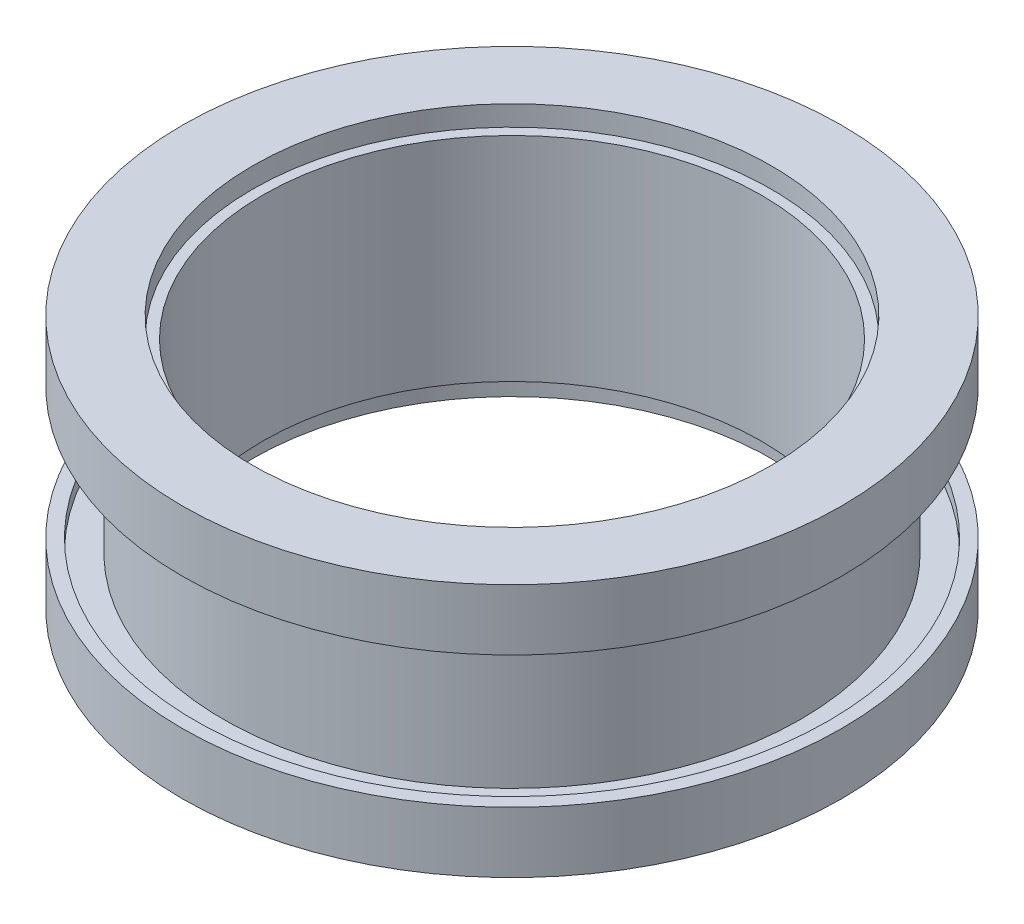
ISO-10303-21;
HEADER;
FILE_DESCRIPTION(('STEP AP214'),'2;1');
FILE_NAME('part.step','',(''),(''),'','','');
FILE_SCHEMA(('AUTOMOTIVE_DESIGN { 1 0 10303 214 1 1 1 1 }'));
ENDSEC;
DATA;
#1=APPLICATION_CONTEXT('core data for automotive mechanical design processes');
#2=APPLICATION_PROTOCOL_DEFINITION('international standard','automotive_design',2000,#1);
#3=PRODUCT_CONTEXT('',#1,'mechanical');
#4=PRODUCT('Part','Part','',(#3));
#5=PRODUCT_RELATED_PRODUCT_CATEGORY('part','',(#4));
#6=PRODUCT_DEFINITION_FORMATION('','',#4);
#7=PRODUCT_DEFINITION_CONTEXT('part definition',#1,'design');
#8=PRODUCT_DEFINITION('design','',#6,#7);
#9=PRODUCT_DEFINITION_SHAPE('','',#8);
#10=(LENGTH_UNIT() NAMED_UNIT(*) SI_UNIT(.MILLI.,.METRE.));
#11=(NAMED_UNIT(*) PLANE_ANGLE_UNIT() SI_UNIT($,.RADIAN.));
#12=(NAMED_UNIT(*) SI_UNIT($,.STERADIAN.) SOLID_ANGLE_UNIT());
#13=UNCERTAINTY_MEASURE_WITH_UNIT(LENGTH_MEASURE(1.E-05),#10,'distance_accuracy_value','');
#14=(GEOMETRIC_REPRESENTATION_CONTEXT(3) GLOBAL_UNCERTAINTY_ASSIGNED_CONTEXT((#13)) GLOBAL_UNIT_ASSIGNED_CONTEXT((#10,
#11,#12)) REPRESENTATION_CONTEXT('',''));
#15=CARTESIAN_POINT('',(0.,0.,0.));
#16=DIRECTION('',(0.,0.,1.));
#17=DIRECTION('',(1.,0.,0.));
#18=AXIS2_PLACEMENT_3D('',#15,#16,#17);
#19=CARTESIAN_POINT('',(51.15,21.,0.));
#20=DIRECTION('',(0.,1.,0.));
#21=DIRECTION('',(1.,0.,0.));
#22=AXIS2_PLACEMENT_3D('',#19,#20,#21);
#23=PLANE('',#22);
#24=CARTESIAN_POINT('',(0.,21.,0.));
#25=DIRECTION('',(0.,-1.,0.));
#26=DIRECTION('',(1.,0.,0.));
#27=AXIS2_PLACEMENT_3D('',#24,#25,#26);
#28=CIRCLE('',#27,49.15);
#29=CARTESIAN_POINT('',(-49.15,21.,0.));
#30=VERTEX_POINT('',#29);
#31=EDGE_CURVE('E11',#30,#30,#28,.T.);
#32=ORIENTED_EDGE('',*,*,#31,.T.);
#33=EDGE_LOOP('',(#32));
#34=FACE_BOUND('',#33,.T.);
#35=CARTESIAN_POINT('',(0.,21.,0.));
#36=DIRECTION('',(0.,-1.,0.));
#37=DIRECTION('',(1.,0.,0.));
#38=AXIS2_PLACEMENT_3D('',#35,#36,#37);
#39=CIRCLE('',#38,51.15);
#40=CARTESIAN_POINT('',(-51.15,21.,0.));
#41=VERTEX_POINT('',#40);
#42=EDGE_CURVE('E119',#41,#41,#39,.T.);
#43=ORIENTED_EDGE('',*,*,#42,.F.);
#44=EDGE_LOOP('',(#43));
#45=FACE_BOUND('',#44,.T.);
#46=ADVANCED_FACE('F17',(#34,#45),#23,.T.);
#47=CARTESIAN_POINT('',(0.,0.,0.));
#48=DIRECTION('',(0.,-1.,0.));
#49=DIRECTION('',(1.,0.,0.));
#50=AXIS2_PLACEMENT_3D('',#47,#48,#49);
#51=CYLINDRICAL_SURFACE('',#50,49.15);
#52=CARTESIAN_POINT('',(0.,-21.,0.));
#53=DIRECTION('',(0.,-1.,0.));
#54=DIRECTION('',(1.,0.,0.));
#55=AXIS2_PLACEMENT_3D('',#52,#53,#54);
#56=CIRCLE('',#55,49.15);
#57=CARTESIAN_POINT('',(-49.15,-21.,0.));
#58=VERTEX_POINT('',#57);
#59=EDGE_CURVE('E113',#58,#58,#56,.T.);
#60=ORIENTED_EDGE('',*,*,#59,.T.);
#61=DIRECTION('',(0.,1.,0.));
#62=VECTOR('',#61,1.);
#63=CARTESIAN_POINT('',(-49.15,0.,0.));
#64=LINE('',#63,#62);
#65=EDGE_CURVE('E21',#58,#30,#64,.T.);
#66=ORIENTED_EDGE('',*,*,#65,.T.);
#67=ORIENTED_EDGE('',*,*,#31,.F.);
#68=ORIENTED_EDGE('',*,*,#65,.F.);
#69=EDGE_LOOP('',(#60,#66,#67,#68));
#70=FACE_BOUND('',#69,.T.);
#71=ADVANCED_FACE('F19',(#70),#51,.F.);
#72=CARTESIAN_POINT('',(49.15,-21.,0.));
#73=DIRECTION('',(0.,-1.,0.));
#74=DIRECTION('',(0.,0.,-1.));
#75=AXIS2_PLACEMENT_3D('',#72,#73,#74);
#76=PLANE('',#75);
#77=ORIENTED_EDGE('',*,*,#59,.F.);
#78=EDGE_LOOP('',(#77));
#79=FACE_BOUND('',#78,.T.);
#80=CARTESIAN_POINT('',(0.,-21.,0.));
#81=DIRECTION('',(0.,-1.,0.));
#82=DIRECTION('',(1.,0.,0.));
#83=AXIS2_PLACEMENT_3D('',#80,#81,#82);
#84=CIRCLE('',#83,51.15);
#85=CARTESIAN_POINT('',(-51.15,-21.,0.));
#86=VERTEX_POINT('',#85);
#87=EDGE_CURVE('E140',#86,#86,#84,.T.);
#88=ORIENTED_EDGE('',*,*,#87,.T.);
#89=EDGE_LOOP('',(#88));
#90=FACE_BOUND('',#89,.T.);
#91=ADVANCED_FACE('F213',(#79,#90),#76,.T.);
#92=CARTESIAN_POINT('',(0.,-23.,0.));
#93=DIRECTION('',(0.,-1.,0.));
#94=DIRECTION('',(1.,0.,0.));
#95=AXIS2_PLACEMENT_3D('',#92,#93,#94);
#96=CYLINDRICAL_SURFACE('',#95,51.15);
#97=CARTESIAN_POINT('',(0.,-25.,0.));
#98=DIRECTION('',(0.,-1.,0.));
#99=DIRECTION('',(1.,0.,0.));
#100=AXIS2_PLACEMENT_3D('',#97,#98,#99);
#101=CIRCLE('',#100,51.15);
#102=CARTESIAN_POINT('',(-51.15,-25.,0.));
#103=VERTEX_POINT('',#102);
#104=EDGE_CURVE('E123',#103,#103,#101,.T.);
#105=ORIENTED_EDGE('',*,*,#104,.T.);
#106=DIRECTION('',(0.,1.,0.));
#107=VECTOR('',#106,1.);
#108=CARTESIAN_POINT('',(-51.15,-23.,0.));
#109=LINE('',#108,#107);
#110=EDGE_CURVE('E137',#103,#86,#109,.T.);
#111=ORIENTED_EDGE('',*,*,#110,.T.);
#112=ORIENTED_EDGE('',*,*,#87,.F.);
#113=ORIENTED_EDGE('',*,*,#110,.F.);
#114=EDGE_LOOP('',(#105,#111,#112,#113));
#115=FACE_BOUND('',#114,.T.);
#116=ADVANCED_FACE('F181',(#115),#96,.F.);
#117=CARTESIAN_POINT('',(51.15,-25.,0.));
#118=DIRECTION('',(0.,-1.,0.));
#119=DIRECTION('',(0.,0.,-1.));
#120=AXIS2_PLACEMENT_3D('',#117,#118,#119);
#121=PLANE('',#120);
#122=ORIENTED_EDGE('',*,*,#104,.F.);
#123=EDGE_LOOP('',(#122));
#124=FACE_BOUND('',#123,.T.);
#125=CARTESIAN_POINT('',(0.,-25.,0.));
#126=DIRECTION('',(0.,-1.,0.));
#127=DIRECTION('',(1.,0.,0.));
#128=AXIS2_PLACEMENT_3D('',#125,#126,#127);
#129=CIRCLE('',#128,65.);
#130=CARTESIAN_POINT('',(-65.,-25.,0.));
#131=VERTEX_POINT('',#130);
#132=EDGE_CURVE('E124',#131,#131,#129,.T.);
#133=ORIENTED_EDGE('',*,*,#132,.T.);
#134=EDGE_LOOP('',(#133));
#135=FACE_BOUND('',#134,.T.);
#136=ADVANCED_FACE('F184',(#124,#135),#121,.T.);
#137=CARTESIAN_POINT('',(0.,-19.,0.));
#138=DIRECTION('',(0.,-1.,0.));
#139=DIRECTION('',(1.,0.,0.));
#140=AXIS2_PLACEMENT_3D('',#137,#138,#139);
#141=CYLINDRICAL_SURFACE('',#140,65.);
#142=ORIENTED_EDGE('',*,*,#132,.F.);
#143=DIRECTION('',(0.,1.,0.));
#144=VECTOR('',#143,1.);
#145=CARTESIAN_POINT('',(-65.,-19.,0.));
#146=LINE('',#145,#144);
#147=CARTESIAN_POINT('',(-65.,-13.,0.));
#148=VERTEX_POINT('',#147);
#149=EDGE_CURVE('E120',#131,#148,#146,.T.);
#150=ORIENTED_EDGE('',*,*,#149,.T.);
#151=CARTESIAN_POINT('',(0.,-13.,0.));
#152=DIRECTION('',(0.,-1.,0.));
#153=DIRECTION('',(1.,0.,0.));
#154=AXIS2_PLACEMENT_3D('',#151,#152,#153);
#155=CIRCLE('',#154,65.);
#156=EDGE_CURVE('E148',#148,#148,#155,.T.);
#157=ORIENTED_EDGE('',*,*,#156,.T.);
#158=ORIENTED_EDGE('',*,*,#149,.F.);
#159=EDGE_LOOP('',(#142,#150,#157,#158));
#160=FACE_BOUND('',#159,.T.);
#161=ADVANCED_FACE('F187',(#160),#141,.T.);
#162=CARTESIAN_POINT('',(65.,-13.,0.));
#163=DIRECTION('',(0.,1.,0.));
#164=DIRECTION('',(1.,0.,0.));
#165=AXIS2_PLACEMENT_3D('',#162,#163,#164);
#166=PLANE('',#165);
#167=CARTESIAN_POINT('',(0.,-13.,0.));
#168=DIRECTION('',(0.,-1.,0.));
#169=DIRECTION('',(1.,0.,0.));
#170=AXIS2_PLACEMENT_3D('',#167,#168,#169);
#171=CIRCLE('',#170,62.4);
#172=CARTESIAN_POINT('',(-62.4,-13.,0.));
#173=VERTEX_POINT('',#172);
#174=EDGE_CURVE('E152',#173,#173,#171,.T.);
#175=ORIENTED_EDGE('',*,*,#174,.T.);
#176=EDGE_LOOP('',(#175));
#177=FACE_BOUND('',#176,.T.);
#178=ORIENTED_EDGE('',*,*,#156,.F.);
#179=EDGE_LOOP('',(#178));
#180=FACE_BOUND('',#179,.T.);
#181=ADVANCED_FACE('F193',(#177,#180),#166,.T.);
#182=CARTESIAN_POINT('',(0.,-14.25,0.));
#183=DIRECTION('',(0.,-1.,0.));
#184=DIRECTION('',(1.,0.,0.));
#185=AXIS2_PLACEMENT_3D('',#182,#183,#184);
#186=CYLINDRICAL_SURFACE('',#185,62.4);
#187=CARTESIAN_POINT('',(0.,-15.5,0.));
#188=DIRECTION('',(0.,-1.,0.));
#189=DIRECTION('',(1.,0.,0.));
#190=AXIS2_PLACEMENT_3D('',#187,#188,#189);
#191=CIRCLE('',#190,62.4);
#192=CARTESIAN_POINT('',(-62.4,-15.5,0.));
#193=VERTEX_POINT('',#192);
#194=EDGE_CURVE('E100',#193,#193,#191,.T.);
#195=ORIENTED_EDGE('',*,*,#194,.T.);
#196=DIRECTION('',(0.,1.,0.));
#197=VECTOR('',#196,1.);
#198=CARTESIAN_POINT('',(-62.4,-14.25,0.));
#199=LINE('',#198,#197);
#200=EDGE_CURVE('E108',#193,#173,#199,.T.);
#201=ORIENTED_EDGE('',*,*,#200,.T.);
#202=ORIENTED_EDGE('',*,*,#174,.F.);
#203=ORIENTED_EDGE('',*,*,#200,.F.);
#204=EDGE_LOOP('',(#195,#201,#202,#203));
#205=FACE_BOUND('',#204,.T.);
#206=ADVANCED_FACE('F195',(#205),#186,.F.);
#207=CARTESIAN_POINT('',(62.4,-15.5,0.));
#208=DIRECTION('',(0.,1.,0.));
#209=DIRECTION('',(1.,0.,0.));
#210=AXIS2_PLACEMENT_3D('',#207,#208,#209);
#211=PLANE('',#210);
#212=CARTESIAN_POINT('',(0.,-15.5,0.));
#213=DIRECTION('',(0.,-1.,0.));
#214=DIRECTION('',(1.,0.,0.));
#215=AXIS2_PLACEMENT_3D('',#212,#213,#214);
#216=CIRCLE('',#215,56.9);
#217=CARTESIAN_POINT('',(-56.9,-15.5,0.));
#218=VERTEX_POINT('',#217);
#219=EDGE_CURVE('E98',#218,#218,#216,.T.);
#220=ORIENTED_EDGE('',*,*,#219,.T.);
#221=EDGE_LOOP('',(#220));
#222=FACE_BOUND('',#221,.T.);
#223=ORIENTED_EDGE('',*,*,#194,.F.);
#224=EDGE_LOOP('',(#223));
#225=FACE_BOUND('',#224,.T.);
#226=ADVANCED_FACE('F203',(#222,#225),#211,.T.);
#227=CARTESIAN_POINT('',(0.,0.,0.));
#228=DIRECTION('',(0.,-1.,0.));
#229=DIRECTION('',(1.,0.,0.));
#230=AXIS2_PLACEMENT_3D('',#227,#228,#229);
#231=CYLINDRICAL_SURFACE('',#230,56.9);
#232=ORIENTED_EDGE('',*,*,#219,.F.);
#233=DIRECTION('',(0.,1.,0.));
#234=VECTOR('',#233,1.);
#235=CARTESIAN_POINT('',(-56.9,0.,0.));
#236=LINE('',#235,#234);
#237=CARTESIAN_POINT('',(-56.9,15.5,0.));
#238=VERTEX_POINT('',#237);
#239=EDGE_CURVE('E93',#218,#238,#236,.T.);
#240=ORIENTED_EDGE('',*,*,#239,.T.);
#241=CARTESIAN_POINT('',(0.,15.5,0.));
#242=DIRECTION('',(0.,-1.,0.));
#243=DIRECTION('',(1.,0.,0.));
#244=AXIS2_PLACEMENT_3D('',#241,#242,#243);
#245=CIRCLE('',#244,56.9);
#246=EDGE_CURVE('E96',#238,#238,#245,.T.);
#247=ORIENTED_EDGE('',*,*,#246,.T.);
#248=ORIENTED_EDGE('',*,*,#239,.F.);
#249=EDGE_LOOP('',(#232,#240,#247,#248));
#250=FACE_BOUND('',#249,.T.);
#251=ADVANCED_FACE('F94',(#250),#231,.T.);
#252=CARTESIAN_POINT('',(56.9,15.5,0.));
#253=DIRECTION('',(0.,-1.,0.));
#254=DIRECTION('',(0.,0.,-1.));
#255=AXIS2_PLACEMENT_3D('',#252,#253,#254);
#256=PLANE('',#255);
#257=ORIENTED_EDGE('',*,*,#246,.F.);
#258=EDGE_LOOP('',(#257));
#259=FACE_BOUND('',#258,.T.);
#260=CARTESIAN_POINT('',(0.,15.5,0.));
#261=DIRECTION('',(0.,-1.,0.));
#262=DIRECTION('',(1.,0.,0.));
#263=AXIS2_PLACEMENT_3D('',#260,#261,#262);
#264=CIRCLE('',#263,62.4);
#265=CARTESIAN_POINT('',(-62.4,15.5,0.));
#266=VERTEX_POINT('',#265);
#267=EDGE_CURVE('E133',#266,#266,#264,.T.);
#268=ORIENTED_EDGE('',*,*,#267,.T.);
#269=EDGE_LOOP('',(#268));
#270=FACE_BOUND('',#269,.T.);
#271=ADVANCED_FACE('F231',(#259,#270),#256,.T.);
#272=CARTESIAN_POINT('',(0.,14.25,0.));
#273=DIRECTION('',(0.,-1.,0.));
#274=DIRECTION('',(1.,0.,0.));
#275=AXIS2_PLACEMENT_3D('',#272,#273,#274);
#276=CYLINDRICAL_SURFACE('',#275,62.4);
#277=CARTESIAN_POINT('',(0.,13.,0.));
#278=DIRECTION('',(0.,-1.,0.));
#279=DIRECTION('',(1.,0.,0.));
#280=AXIS2_PLACEMENT_3D('',#277,#278,#279);
#281=CIRCLE('',#280,62.4);
#282=CARTESIAN_POINT('',(-62.4,13.,0.));
#283=VERTEX_POINT('',#282);
#284=EDGE_CURVE('E156',#283,#283,#281,.T.);
#285=ORIENTED_EDGE('',*,*,#284,.T.);
#286=DIRECTION('',(0.,1.,0.));
#287=VECTOR('',#286,1.);
#288=CARTESIAN_POINT('',(-62.4,14.25,0.));
#289=LINE('',#288,#287);
#290=EDGE_CURVE('E136',#283,#266,#289,.T.);
#291=ORIENTED_EDGE('',*,*,#290,.T.);
#292=ORIENTED_EDGE('',*,*,#267,.F.);
#293=ORIENTED_EDGE('',*,*,#290,.F.);
#294=EDGE_LOOP('',(#285,#291,#292,#293));
#295=FACE_BOUND('',#294,.T.);
#296=ADVANCED_FACE('F226',(#295),#276,.F.);
#297=CARTESIAN_POINT('',(62.4,13.,0.));
#298=DIRECTION('',(0.,-1.,0.));
#299=DIRECTION('',(0.,0.,-1.));
#300=AXIS2_PLACEMENT_3D('',#297,#298,#299);
#301=PLANE('',#300);
#302=ORIENTED_EDGE('',*,*,#284,.F.);
#303=EDGE_LOOP('',(#302));
#304=FACE_BOUND('',#303,.T.);
#305=CARTESIAN_POINT('',(0.,13.,0.));
#306=DIRECTION('',(0.,-1.,0.));
#307=DIRECTION('',(1.,0.,0.));
#308=AXIS2_PLACEMENT_3D('',#305,#306,#307);
#309=CIRCLE('',#308,65.);
#310=CARTESIAN_POINT('',(-65.,13.,0.));
#311=VERTEX_POINT('',#310);
#312=EDGE_CURVE('E125',#311,#311,#309,.T.);
#313=ORIENTED_EDGE('',*,*,#312,.T.);
#314=EDGE_LOOP('',(#313));
#315=FACE_BOUND('',#314,.T.);
#316=ADVANCED_FACE('F223',(#304,#315),#301,.T.);
#317=CARTESIAN_POINT('',(0.,19.,0.));
#318=DIRECTION('',(0.,-1.,0.));
#319=DIRECTION('',(1.,0.,0.));
#320=AXIS2_PLACEMENT_3D('',#317,#318,#319);
#321=CYLINDRICAL_SURFACE('',#320,65.);
#322=ORIENTED_EDGE('',*,*,#312,.F.);
#323=DIRECTION('',(0.,1.,0.));
#324=VECTOR('',#323,1.);
#325=CARTESIAN_POINT('',(-65.,19.,0.));
#326=LINE('',#325,#324);
#327=CARTESIAN_POINT('',(-65.,25.,0.));
#328=VERTEX_POINT('',#327);
#329=EDGE_CURVE('E129',#311,#328,#326,.T.);
#330=ORIENTED_EDGE('',*,*,#329,.T.);
#331=CARTESIAN_POINT('',(0.,25.,0.));
#332=DIRECTION('',(0.,-1.,0.));
#333=DIRECTION('',(1.,0.,0.));
#334=AXIS2_PLACEMENT_3D('',#331,#332,#333);
#335=CIRCLE('',#334,65.);
#336=EDGE_CURVE('E130',#328,#328,#335,.T.);
#337=ORIENTED_EDGE('',*,*,#336,.T.);
#338=ORIENTED_EDGE('',*,*,#329,.F.);
#339=EDGE_LOOP('',(#322,#330,#337,#338));
#340=FACE_BOUND('',#339,.T.);
#341=ADVANCED_FACE('F221',(#340),#321,.T.);
#342=CARTESIAN_POINT('',(65.,25.,0.));
#343=DIRECTION('',(0.,1.,0.));
#344=DIRECTION('',(1.,0.,0.));
#345=AXIS2_PLACEMENT_3D('',#342,#343,#344);
#346=PLANE('',#345);
#347=CARTESIAN_POINT('',(0.,25.,0.));
#348=DIRECTION('',(0.,-1.,0.));
#349=DIRECTION('',(1.,0.,0.));
#350=AXIS2_PLACEMENT_3D('',#347,#348,#349);
#351=CIRCLE('',#350,51.15);
#352=CARTESIAN_POINT('',(-51.15,25.,0.));
#353=VERTEX_POINT('',#352);
#354=EDGE_CURVE('E118',#353,#353,#351,.T.);
#355=ORIENTED_EDGE('',*,*,#354,.T.);
#356=EDGE_LOOP('',(#355));
#357=FACE_BOUND('',#356,.T.);
#358=ORIENTED_EDGE('',*,*,#336,.F.);
#359=EDGE_LOOP('',(#358));
#360=FACE_BOUND('',#359,.T.);
#361=ADVANCED_FACE('F217',(#357,#360),#346,.T.);
#362=CARTESIAN_POINT('',(0.,23.,0.));
#363=DIRECTION('',(0.,-1.,0.));
#364=DIRECTION('',(1.,0.,0.));
#365=AXIS2_PLACEMENT_3D('',#362,#363,#364);
#366=CYLINDRICAL_SURFACE('',#365,51.15);
#367=ORIENTED_EDGE('',*,*,#42,.T.);
#368=DIRECTION('',(0.,1.,0.));
#369=VECTOR('',#368,1.);
#370=CARTESIAN_POINT('',(-51.15,23.,0.));
#371=LINE('',#370,#369);
#372=EDGE_CURVE('E114',#41,#353,#371,.T.);
#373=ORIENTED_EDGE('',*,*,#372,.T.);
#374=ORIENTED_EDGE('',*,*,#354,.F.);
#375=ORIENTED_EDGE('',*,*,#372,.F.);
#376=EDGE_LOOP('',(#367,#373,#374,#375));
#377=FACE_BOUND('',#376,.T.);
#378=ADVANCED_FACE('F220',(#377),#366,.F.);
#379=CLOSED_SHELL('',(#46,#71,#91,#116,#136,#161,#181,#206,#226,#251,#271,#296,#316,#341,#361,#378));
#380=MANIFOLD_SOLID_BREP('B1',#379);
#381=ADVANCED_BREP_SHAPE_REPRESENTATION('',(#18,#380),#14);
#382=SHAPE_DEFINITION_REPRESENTATION(#9,#381);
ENDSEC;
END-ISO-10303-21;
